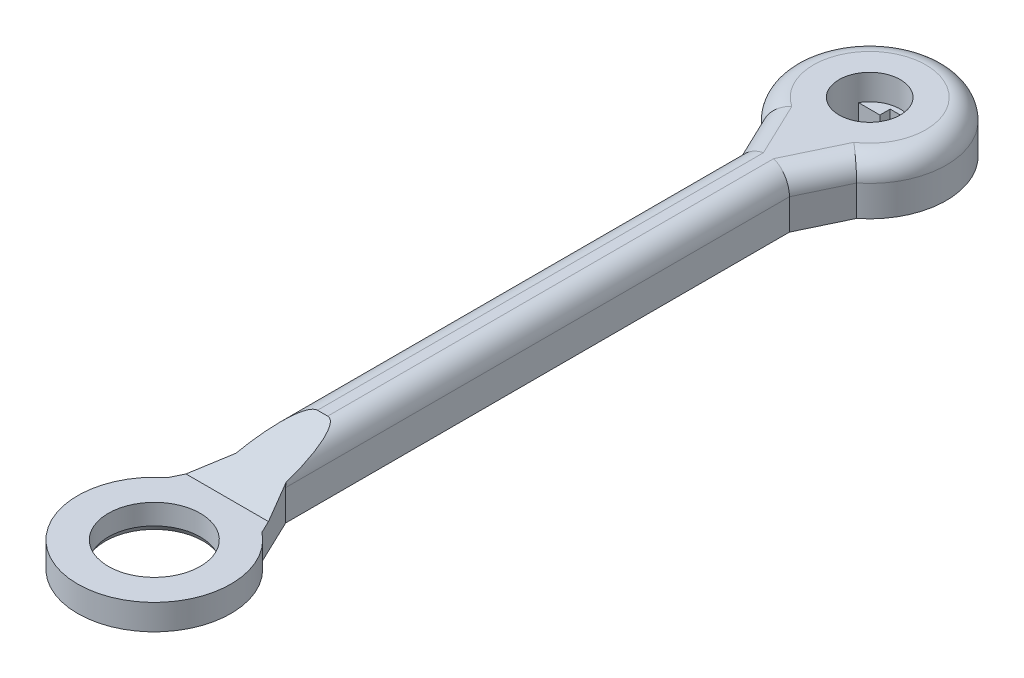
ISO-10303-21;
HEADER;
FILE_DESCRIPTION(('STEP AP214'),'2;1');
FILE_NAME('part.step','',(''),(''),'','','');
FILE_SCHEMA(('AUTOMOTIVE_DESIGN { 1 0 10303 214 1 1 1 1 }'));
ENDSEC;
DATA;
#1=APPLICATION_CONTEXT('core data for automotive mechanical design processes');
#2=APPLICATION_PROTOCOL_DEFINITION('international standard','automotive_design',2000,#1);
#3=PRODUCT_CONTEXT('',#1,'mechanical');
#4=PRODUCT('Part','Part','',(#3));
#5=PRODUCT_RELATED_PRODUCT_CATEGORY('part','',(#4));
#6=PRODUCT_DEFINITION_FORMATION('','',#4);
#7=PRODUCT_DEFINITION_CONTEXT('part definition',#1,'design');
#8=PRODUCT_DEFINITION('design','',#6,#7);
#9=PRODUCT_DEFINITION_SHAPE('','',#8);
#10=(LENGTH_UNIT() NAMED_UNIT(*) SI_UNIT(.MILLI.,.METRE.));
#11=(NAMED_UNIT(*) PLANE_ANGLE_UNIT() SI_UNIT($,.RADIAN.));
#12=(NAMED_UNIT(*) SI_UNIT($,.STERADIAN.) SOLID_ANGLE_UNIT());
#13=UNCERTAINTY_MEASURE_WITH_UNIT(LENGTH_MEASURE(1.E-05),#10,'distance_accuracy_value','');
#14=(GEOMETRIC_REPRESENTATION_CONTEXT(3) GLOBAL_UNCERTAINTY_ASSIGNED_CONTEXT((#13)) GLOBAL_UNIT_ASSIGNED_CONTEXT((#10,
#11,#12)) REPRESENTATION_CONTEXT('',''));
#15=CARTESIAN_POINT('',(0.,0.,0.));
#16=DIRECTION('',(0.,0.,1.));
#17=DIRECTION('',(1.,0.,0.));
#18=AXIS2_PLACEMENT_3D('',#15,#16,#17);
#19=CARTESIAN_POINT('',(0.,5.,-35.));
#20=DIRECTION('',(0.,-1.,0.));
#21=DIRECTION('',(0.,0.,-1.));
#22=AXIS2_PLACEMENT_3D('',#19,#20,#21);
#23=CYLINDRICAL_SURFACE('',#22,3.);
#24=CARTESIAN_POINT('',(0.,5.,-35.));
#25=DIRECTION('',(0.,1.,0.));
#26=DIRECTION('',(0.,0.,1.));
#27=AXIS2_PLACEMENT_3D('',#24,#25,#26);
#28=CIRCLE('',#27,3.);
#29=CARTESIAN_POINT('',(0.,5.,-32.));
#30=VERTEX_POINT('',#29);
#31=EDGE_CURVE('E234',#30,#30,#28,.T.);
#32=ORIENTED_EDGE('',*,*,#31,.T.);
#33=EDGE_LOOP('',(#32));
#34=FACE_BOUND('',#33,.T.);
#35=DIRECTION('',(0.,-1.,0.));
#36=VECTOR('',#35,1.);
#37=CARTESIAN_POINT('',(2.59807621135331,5.,-36.5));
#38=LINE('',#37,#36);
#39=CARTESIAN_POINT('',(2.59807621135331,2.5,-36.5));
#40=VERTEX_POINT('',#39);
#41=CARTESIAN_POINT('',(2.59807621135331,0.500000000000024,-36.5));
#42=VERTEX_POINT('',#41);
#43=EDGE_CURVE('E338',#40,#42,#38,.T.);
#44=ORIENTED_EDGE('',*,*,#43,.T.);
#45=CARTESIAN_POINT('',(0.,0.500000000000024,-35.));
#46=DIRECTION('',(0.,1.,0.));
#47=DIRECTION('',(0.,0.,1.));
#48=AXIS2_PLACEMENT_3D('',#45,#46,#47);
#49=CIRCLE('',#48,3.);
#50=CARTESIAN_POINT('',(-2.59807621135332,0.500000000000024,-36.5));
#51=VERTEX_POINT('',#50);
#52=EDGE_CURVE('E372',#42,#51,#49,.F.);
#53=ORIENTED_EDGE('',*,*,#52,.T.);
#54=DIRECTION('',(0.,-1.,0.));
#55=VECTOR('',#54,1.);
#56=CARTESIAN_POINT('',(-2.59807621135332,5.,-36.5));
#57=LINE('',#56,#55);
#58=CARTESIAN_POINT('',(-2.59807621135332,2.5,-36.5));
#59=VERTEX_POINT('',#58);
#60=EDGE_CURVE('E341',#51,#59,#57,.F.);
#61=ORIENTED_EDGE('',*,*,#60,.T.);
#62=CARTESIAN_POINT('',(0.,2.5,-35.));
#63=DIRECTION('',(0.,-1.,0.));
#64=DIRECTION('',(0.,0.,-1.));
#65=AXIS2_PLACEMENT_3D('',#62,#63,#64);
#66=CIRCLE('',#65,3.);
#67=EDGE_CURVE('E189',#59,#40,#66,.T.);
#68=ORIENTED_EDGE('',*,*,#67,.T.);
#69=EDGE_LOOP('',(#44,#53,#61,#68));
#70=FACE_BOUND('',#69,.T.);
#71=ADVANCED_FACE('F33',(#34,#70),#23,.F.);
#72=CARTESIAN_POINT('',(0.,5.,-35.));
#73=DIRECTION('',(0.,-1.,0.));
#74=DIRECTION('',(0.,0.,-1.));
#75=AXIS2_PLACEMENT_3D('',#72,#73,#74);
#76=CYLINDRICAL_SURFACE('',#75,7.5);
#77=DIRECTION('',(0.,-1.,0.));
#78=VECTOR('',#77,1.);
#79=CARTESIAN_POINT('',(-4.62423069783177,5.,-29.0952146141261));
#80=LINE('',#79,#78);
#81=CARTESIAN_POINT('',(-4.62423069783177,0.,-29.0952146141261));
#82=VERTEX_POINT('',#81);
#83=CARTESIAN_POINT('',(-4.62423069783177,3.,-29.0952146141261));
#84=VERTEX_POINT('',#83);
#85=EDGE_CURVE('E256',#82,#84,#80,.F.);
#86=ORIENTED_EDGE('',*,*,#85,.T.);
#87=CARTESIAN_POINT('',(0.,3.,-35.));
#88=DIRECTION('',(0.,1.,0.));
#89=DIRECTION('',(0.,0.,1.));
#90=AXIS2_PLACEMENT_3D('',#87,#88,#89);
#91=CIRCLE('',#90,7.5);
#92=CARTESIAN_POINT('',(4.62423069783176,3.,-29.0952146141261));
#93=VERTEX_POINT('',#92);
#94=EDGE_CURVE('E293',#84,#93,#91,.F.);
#95=ORIENTED_EDGE('',*,*,#94,.T.);
#96=DIRECTION('',(0.,-1.,0.));
#97=VECTOR('',#96,1.);
#98=CARTESIAN_POINT('',(4.62423069783176,5.,-29.0952146141261));
#99=LINE('',#98,#97);
#100=CARTESIAN_POINT('',(4.62423069783176,0.,-29.0952146141261));
#101=VERTEX_POINT('',#100);
#102=EDGE_CURVE('E254',#93,#101,#99,.T.);
#103=ORIENTED_EDGE('',*,*,#102,.T.);
#104=CARTESIAN_POINT('',(0.,0.,-35.));
#105=DIRECTION('',(0.,1.,0.));
#106=DIRECTION('',(0.,0.,1.));
#107=AXIS2_PLACEMENT_3D('',#104,#105,#106);
#108=CIRCLE('',#107,7.5);
#109=EDGE_CURVE('E240',#101,#82,#108,.T.);
#110=ORIENTED_EDGE('',*,*,#109,.T.);
#111=EDGE_LOOP('',(#86,#95,#103,#110));
#112=FACE_BOUND('',#111,.T.);
#113=ADVANCED_FACE('F419',(#112),#76,.T.);
#114=CARTESIAN_POINT('',(-2.5,5.,0.));
#115=DIRECTION('',(1.,0.,0.));
#116=DIRECTION('',(0.,0.,-1.));
#117=AXIS2_PLACEMENT_3D('',#114,#115,#116);
#118=PLANE('',#117);
#119=DIRECTION('',(0.,1.,0.));
#120=VECTOR('',#119,1.);
#121=CARTESIAN_POINT('',(-2.5,5.,24.6474232240663));
#122=LINE('',#121,#120);
#123=CARTESIAN_POINT('',(-2.5,0.,24.6474232240663));
#124=VERTEX_POINT('',#123);
#125=CARTESIAN_POINT('',(-2.5,3.,24.6474232240663));
#126=VERTEX_POINT('',#125);
#127=EDGE_CURVE('E249',#124,#126,#122,.T.);
#128=ORIENTED_EDGE('',*,*,#127,.T.);
#129=DIRECTION('',(0.,0.,1.));
#130=VECTOR('',#129,1.);
#131=CARTESIAN_POINT('',(-2.5,3.,-24.6474232240663));
#132=LINE('',#131,#130);
#133=CARTESIAN_POINT('',(-2.5,3.,-24.6474232240663));
#134=VERTEX_POINT('',#133);
#135=EDGE_CURVE('E297',#126,#134,#132,.F.);
#136=ORIENTED_EDGE('',*,*,#135,.T.);
#137=DIRECTION('',(0.,-1.,0.));
#138=VECTOR('',#137,1.);
#139=CARTESIAN_POINT('',(-2.5,0.,-24.6474232240663));
#140=LINE('',#139,#138);
#141=CARTESIAN_POINT('',(-2.5,0.,-24.6474232240663));
#142=VERTEX_POINT('',#141);
#143=EDGE_CURVE('E252',#134,#142,#140,.T.);
#144=ORIENTED_EDGE('',*,*,#143,.T.);
#145=DIRECTION('',(0.,0.,1.));
#146=VECTOR('',#145,1.);
#147=CARTESIAN_POINT('',(-2.5,0.,0.));
#148=LINE('',#147,#146);
#149=EDGE_CURVE('E243',#142,#124,#148,.T.);
#150=ORIENTED_EDGE('',*,*,#149,.T.);
#151=EDGE_LOOP('',(#128,#136,#144,#150));
#152=FACE_BOUND('',#151,.T.);
#153=ADVANCED_FACE('F425',(#152),#118,.F.);
#154=CARTESIAN_POINT('',(2.5,5.,0.));
#155=DIRECTION('',(1.,0.,0.));
#156=DIRECTION('',(0.,0.,-1.));
#157=AXIS2_PLACEMENT_3D('',#154,#155,#156);
#158=PLANE('',#157);
#159=DIRECTION('',(0.,1.,0.));
#160=VECTOR('',#159,1.);
#161=CARTESIAN_POINT('',(2.5,5.,-24.6474232240663));
#162=LINE('',#161,#160);
#163=CARTESIAN_POINT('',(2.5,0.,-24.6474232240663));
#164=VERTEX_POINT('',#163);
#165=CARTESIAN_POINT('',(2.5,3.,-24.6474232240663));
#166=VERTEX_POINT('',#165);
#167=EDGE_CURVE('E261',#164,#166,#162,.T.);
#168=ORIENTED_EDGE('',*,*,#167,.T.);
#169=DIRECTION('',(0.,0.,1.));
#170=VECTOR('',#169,1.);
#171=CARTESIAN_POINT('',(2.5,3.,0.));
#172=LINE('',#171,#170);
#173=CARTESIAN_POINT('',(2.5,3.,24.6474232240663));
#174=VERTEX_POINT('',#173);
#175=EDGE_CURVE('E299',#166,#174,#172,.T.);
#176=ORIENTED_EDGE('',*,*,#175,.T.);
#177=DIRECTION('',(0.,-1.,0.));
#178=VECTOR('',#177,1.);
#179=CARTESIAN_POINT('',(2.5,0.,24.6474232240663));
#180=LINE('',#179,#178);
#181=CARTESIAN_POINT('',(2.5,0.,24.6474232240663));
#182=VERTEX_POINT('',#181);
#183=EDGE_CURVE('E259',#174,#182,#180,.T.);
#184=ORIENTED_EDGE('',*,*,#183,.T.);
#185=DIRECTION('',(0.,0.,1.));
#186=VECTOR('',#185,1.);
#187=CARTESIAN_POINT('',(2.5,0.,0.));
#188=LINE('',#187,#186);
#189=EDGE_CURVE('E246',#164,#182,#188,.T.);
#190=ORIENTED_EDGE('',*,*,#189,.F.);
#191=EDGE_LOOP('',(#168,#176,#184,#190));
#192=FACE_BOUND('',#191,.T.);
#193=ADVANCED_FACE('F446',(#192),#158,.T.);
#194=CARTESIAN_POINT('',(0.,5.,0.));
#195=DIRECTION('',(0.,1.,0.));
#196=DIRECTION('',(0.,0.,1.));
#197=AXIS2_PLACEMENT_3D('',#194,#195,#196);
#198=PLANE('',#197);
#199=DIRECTION('',(0.,0.,1.));
#200=VECTOR('',#199,1.);
#201=CARTESIAN_POINT('',(-0.499999999999997,5.,24.6474232240663));
#202=LINE('',#201,#200);
#203=CARTESIAN_POINT('',(-0.500000000000003,5.,-25.1005050633883));
#204=VERTEX_POINT('',#203);
#205=CARTESIAN_POINT('',(-0.499999999999998,5.,18.5363087816767));
#206=VERTEX_POINT('',#205);
#207=EDGE_CURVE('E289',#204,#206,#202,.T.);
#208=ORIENTED_EDGE('',*,*,#207,.T.);
#209=DIRECTION('',(1.,0.,0.));
#210=VECTOR('',#209,1.);
#211=CARTESIAN_POINT('',(4.03737545943788,5.,18.5363087816767));
#212=LINE('',#211,#210);
#213=CARTESIAN_POINT('',(0.500000000000004,5.,18.5363087816767));
#214=VERTEX_POINT('',#213);
#215=EDGE_CURVE('E55',#206,#214,#212,.T.);
#216=ORIENTED_EDGE('',*,*,#215,.T.);
#217=DIRECTION('',(0.,0.,1.));
#218=VECTOR('',#217,1.);
#219=CARTESIAN_POINT('',(0.500000000000001,5.,0.));
#220=LINE('',#219,#218);
#221=CARTESIAN_POINT('',(0.499999999999997,5.,-25.1005050633883));
#222=VERTEX_POINT('',#221);
#223=EDGE_CURVE('E280',#214,#222,#220,.F.);
#224=ORIENTED_EDGE('',*,*,#223,.T.);
#225=DIRECTION('',(0.430964406271145,0.,-0.902368927062185));
#226=VECTOR('',#225,1.);
#227=CARTESIAN_POINT('',(2.8194928437074,5.,-29.9571434266684));
#228=LINE('',#227,#226);
#229=CARTESIAN_POINT('',(3.03836359600805,5.,-30.415422957518));
#230=VERTEX_POINT('',#229);
#231=EDGE_CURVE('E282',#222,#230,#228,.T.);
#232=ORIENTED_EDGE('',*,*,#231,.T.);
#233=CARTESIAN_POINT('',(0.,5.,-35.));
#234=DIRECTION('',(0.,1.,0.));
#235=DIRECTION('',(0.,0.,1.));
#236=AXIS2_PLACEMENT_3D('',#233,#234,#235);
#237=CIRCLE('',#236,5.5);
#238=CARTESIAN_POINT('',(-3.03836359600805,5.,-30.415422957518));
#239=VERTEX_POINT('',#238);
#240=EDGE_CURVE('E285',#230,#239,#237,.T.);
#241=ORIENTED_EDGE('',*,*,#240,.T.);
#242=DIRECTION('',(0.430964406271145,0.,0.902368927062186));
#243=VECTOR('',#242,1.);
#244=CARTESIAN_POINT('',(-0.695262145875635,5.,-25.5093520366086));
#245=LINE('',#244,#243);
#246=EDGE_CURVE('E287',#239,#204,#245,.T.);
#247=ORIENTED_EDGE('',*,*,#246,.T.);
#248=EDGE_LOOP('',(#208,#216,#224,#232,#241,#247));
#249=FACE_BOUND('',#248,.T.);
#250=ORIENTED_EDGE('',*,*,#31,.F.);
#251=EDGE_LOOP('',(#250));
#252=FACE_BOUND('',#251,.T.);
#253=ADVANCED_FACE('F443',(#249,#252),#198,.T.);
#254=CARTESIAN_POINT('',(0.,0.,0.));
#255=DIRECTION('',(0.,1.,0.));
#256=DIRECTION('',(0.,0.,1.));
#257=AXIS2_PLACEMENT_3D('',#254,#255,#256);
#258=PLANE('',#257);
#259=CARTESIAN_POINT('',(0.,0.,35.));
#260=DIRECTION('',(0.,1.,0.));
#261=DIRECTION('',(0.,0.,1.));
#262=AXIS2_PLACEMENT_3D('',#259,#260,#261);
#263=CIRCLE('',#262,4.78867513459482);
#264=CARTESIAN_POINT('',(0.,0.,30.2113248654052));
#265=VERTEX_POINT('',#264);
#266=EDGE_CURVE('E356',#265,#265,#263,.T.);
#267=ORIENTED_EDGE('',*,*,#266,.T.);
#268=EDGE_LOOP('',(#267));
#269=FACE_BOUND('',#268,.T.);
#270=DIRECTION('',(-1.,0.,0.));
#271=VECTOR('',#270,1.);
#272=CARTESIAN_POINT('',(0.,0.,-36.7886751345948));
#273=LINE('',#272,#271);
#274=CARTESIAN_POINT('',(2.7597147323201,0.,-36.7886751345948));
#275=VERTEX_POINT('',#274);
#276=CARTESIAN_POINT('',(0.788675134594824,0.,-36.7886751345948));
#277=VERTEX_POINT('',#276);
#278=EDGE_CURVE('E351',#275,#277,#273,.T.);
#279=ORIENTED_EDGE('',*,*,#278,.T.);
#280=DIRECTION('',(0.,0.,-1.));
#281=VECTOR('',#280,1.);
#282=CARTESIAN_POINT('',(0.78867513459482,0.,0.));
#283=LINE('',#282,#281);
#284=CARTESIAN_POINT('',(0.788675134594824,0.,-37.7886751345948));
#285=VERTEX_POINT('',#284);
#286=EDGE_CURVE('E353',#277,#285,#283,.T.);
#287=ORIENTED_EDGE('',*,*,#286,.T.);
#288=DIRECTION('',(-1.,0.,0.));
#289=VECTOR('',#288,1.);
#290=CARTESIAN_POINT('',(0.,0.,-37.7886751345948));
#291=LINE('',#290,#289);
#292=CARTESIAN_POINT('',(-0.788675134594824,0.,-37.7886751345948));
#293=VERTEX_POINT('',#292);
#294=EDGE_CURVE('E349',#285,#293,#291,.T.);
#295=ORIENTED_EDGE('',*,*,#294,.T.);
#296=DIRECTION('',(0.,0.,1.));
#297=VECTOR('',#296,1.);
#298=CARTESIAN_POINT('',(-0.788675134594828,0.,0.));
#299=LINE('',#298,#297);
#300=CARTESIAN_POINT('',(-0.788675134594824,0.,-36.7886751345948));
#301=VERTEX_POINT('',#300);
#302=EDGE_CURVE('E347',#293,#301,#299,.T.);
#303=ORIENTED_EDGE('',*,*,#302,.T.);
#304=DIRECTION('',(-1.,0.,0.));
#305=VECTOR('',#304,1.);
#306=CARTESIAN_POINT('',(0.,0.,-36.7886751345948));
#307=LINE('',#306,#305);
#308=CARTESIAN_POINT('',(-2.75971473232011,0.,-36.7886751345948));
#309=VERTEX_POINT('',#308);
#310=EDGE_CURVE('E345',#301,#309,#307,.T.);
#311=ORIENTED_EDGE('',*,*,#310,.T.);
#312=CARTESIAN_POINT('',(0.,0.,-35.));
#313=DIRECTION('',(0.,1.,0.));
#314=DIRECTION('',(0.,0.,1.));
#315=AXIS2_PLACEMENT_3D('',#312,#313,#314);
#316=CIRCLE('',#315,3.28867513459483);
#317=EDGE_CURVE('E343',#309,#275,#316,.T.);
#318=ORIENTED_EDGE('',*,*,#317,.T.);
#319=EDGE_LOOP('',(#279,#287,#295,#303,#311,#318));
#320=FACE_BOUND('',#319,.T.);
#321=ORIENTED_EDGE('',*,*,#109,.F.);
#322=DIRECTION('',(-0.430964406271145,0.,0.902368927062185));
#323=VECTOR('',#322,1.);
#324=CARTESIAN_POINT('',(-7.54943483026286,0.,-3.60555156736101));
#325=LINE('',#324,#323);
#326=EDGE_CURVE('E271',#101,#164,#325,.T.);
#327=ORIENTED_EDGE('',*,*,#326,.T.);
#328=ORIENTED_EDGE('',*,*,#189,.T.);
#329=DIRECTION('',(0.430964406271145,0.,0.902368927062185));
#330=VECTOR('',#329,1.);
#331=CARTESIAN_POINT('',(-7.54943483026286,0.,3.60555156736101));
#332=LINE('',#331,#330);
#333=CARTESIAN_POINT('',(4.62423069783176,0.,29.0952146141261));
#334=VERTEX_POINT('',#333);
#335=EDGE_CURVE('E275',#182,#334,#332,.T.);
#336=ORIENTED_EDGE('',*,*,#335,.T.);
#337=CARTESIAN_POINT('',(0.,0.,35.));
#338=DIRECTION('',(0.,-1.,0.));
#339=DIRECTION('',(0.,0.,-1.));
#340=AXIS2_PLACEMENT_3D('',#337,#338,#339);
#341=CIRCLE('',#340,7.5);
#342=CARTESIAN_POINT('',(-4.62423069783177,0.,29.0952146141261));
#343=VERTEX_POINT('',#342);
#344=EDGE_CURVE('E237',#334,#343,#341,.T.);
#345=ORIENTED_EDGE('',*,*,#344,.T.);
#346=DIRECTION('',(0.430964406271146,0.,-0.902368927062185));
#347=VECTOR('',#346,1.);
#348=CARTESIAN_POINT('',(7.54943483026287,0.,3.60555156736103));
#349=LINE('',#348,#347);
#350=EDGE_CURVE('E273',#343,#124,#349,.T.);
#351=ORIENTED_EDGE('',*,*,#350,.T.);
#352=ORIENTED_EDGE('',*,*,#149,.F.);
#353=DIRECTION('',(-0.430964406271145,0.,-0.902368927062186));
#354=VECTOR('',#353,1.);
#355=CARTESIAN_POINT('',(7.54943483026284,0.,-3.605551567361));
#356=LINE('',#355,#354);
#357=EDGE_CURVE('E269',#142,#82,#356,.T.);
#358=ORIENTED_EDGE('',*,*,#357,.T.);
#359=EDGE_LOOP('',(#321,#327,#328,#336,#345,#351,#352,#358));
#360=FACE_BOUND('',#359,.T.);
#361=ADVANCED_FACE('F441',(#269,#320,#360),#258,.F.);
#362=CARTESIAN_POINT('',(0.,5.,35.));
#363=DIRECTION('',(0.,-1.,0.));
#364=DIRECTION('',(0.,0.,-1.));
#365=AXIS2_PLACEMENT_3D('',#362,#363,#364);
#366=CYLINDRICAL_SURFACE('',#365,7.5);
#367=CARTESIAN_POINT('',(0.,2.5,35.));
#368=DIRECTION('',(0.,-1.,0.));
#369=DIRECTION('',(0.,0.,-1.));
#370=AXIS2_PLACEMENT_3D('',#367,#368,#369);
#371=CIRCLE('',#370,7.5);
#372=CARTESIAN_POINT('',(-4.62423069783177,2.5,29.0952146141261));
#373=VERTEX_POINT('',#372);
#374=CARTESIAN_POINT('',(4.62423069783176,2.5,29.0952146141261));
#375=VERTEX_POINT('',#374);
#376=EDGE_CURVE('E225',#373,#375,#371,.F.);
#377=ORIENTED_EDGE('',*,*,#376,.F.);
#378=DIRECTION('',(0.,-1.,0.));
#379=VECTOR('',#378,1.);
#380=CARTESIAN_POINT('',(-4.62423069783177,5.,29.0952146141261));
#381=LINE('',#380,#379);
#382=EDGE_CURVE('E267',#373,#343,#381,.T.);
#383=ORIENTED_EDGE('',*,*,#382,.T.);
#384=ORIENTED_EDGE('',*,*,#344,.F.);
#385=DIRECTION('',(0.,-1.,0.));
#386=VECTOR('',#385,1.);
#387=CARTESIAN_POINT('',(4.62423069783176,5.,29.0952146141261));
#388=LINE('',#387,#386);
#389=EDGE_CURVE('E264',#334,#375,#388,.F.);
#390=ORIENTED_EDGE('',*,*,#389,.T.);
#391=EDGE_LOOP('',(#377,#383,#384,#390));
#392=FACE_BOUND('',#391,.T.);
#393=ADVANCED_FACE('F437',(#392),#366,.T.);
#394=CARTESIAN_POINT('',(0.,5.,35.));
#395=DIRECTION('',(0.,-1.,0.));
#396=DIRECTION('',(0.,0.,-1.));
#397=AXIS2_PLACEMENT_3D('',#394,#395,#396);
#398=CYLINDRICAL_SURFACE('',#397,4.5);
#399=CARTESIAN_POINT('',(0.,0.50000000000002,35.));
#400=DIRECTION('',(0.,1.,0.));
#401=DIRECTION('',(0.,0.,1.));
#402=AXIS2_PLACEMENT_3D('',#399,#400,#401);
#403=CIRCLE('',#402,4.5);
#404=CARTESIAN_POINT('',(0.,0.500000000000019,30.5));
#405=VERTEX_POINT('',#404);
#406=EDGE_CURVE('E359',#405,#405,#403,.F.);
#407=ORIENTED_EDGE('',*,*,#406,.T.);
#408=EDGE_LOOP('',(#407));
#409=FACE_BOUND('',#408,.T.);
#410=CARTESIAN_POINT('',(0.,2.5,35.));
#411=DIRECTION('',(0.,-1.,0.));
#412=DIRECTION('',(0.,0.,-1.));
#413=AXIS2_PLACEMENT_3D('',#410,#411,#412);
#414=CIRCLE('',#413,4.5);
#415=CARTESIAN_POINT('',(0.,2.5,30.5));
#416=VERTEX_POINT('',#415);
#417=EDGE_CURVE('E231',#416,#416,#414,.T.);
#418=ORIENTED_EDGE('',*,*,#417,.F.);
#419=EDGE_LOOP('',(#418));
#420=FACE_BOUND('',#419,.T.);
#421=ADVANCED_FACE('F433',(#409,#420),#398,.F.);
#422=CARTESIAN_POINT('',(-2.5,5.,-24.6474232240663));
#423=DIRECTION('',(0.902368927062186,0.,-0.430964406271145));
#424=DIRECTION('',(0.,-1.,0.));
#425=AXIS2_PLACEMENT_3D('',#422,#423,#424);
#426=PLANE('',#425);
#427=ORIENTED_EDGE('',*,*,#143,.F.);
#428=DIRECTION('',(0.430964406271145,0.,0.902368927062186));
#429=VECTOR('',#428,1.);
#430=CARTESIAN_POINT('',(-4.62423069783177,3.,-29.0952146141261));
#431=LINE('',#430,#429);
#432=EDGE_CURVE('E295',#134,#84,#431,.F.);
#433=ORIENTED_EDGE('',*,*,#432,.T.);
#434=ORIENTED_EDGE('',*,*,#85,.F.);
#435=ORIENTED_EDGE('',*,*,#357,.F.);
#436=EDGE_LOOP('',(#427,#433,#434,#435));
#437=FACE_BOUND('',#436,.T.);
#438=ADVANCED_FACE('F436',(#437),#426,.F.);
#439=CARTESIAN_POINT('',(4.62423069783176,5.,-29.0952146141261));
#440=DIRECTION('',(-0.902368927062185,0.,-0.430964406271145));
#441=DIRECTION('',(0.,-1.,0.));
#442=AXIS2_PLACEMENT_3D('',#439,#440,#441);
#443=PLANE('',#442);
#444=ORIENTED_EDGE('',*,*,#102,.F.);
#445=DIRECTION('',(0.430964406271145,0.,-0.902368927062185));
#446=VECTOR('',#445,1.);
#447=CARTESIAN_POINT('',(2.5,3.,-24.6474232240663));
#448=LINE('',#447,#446);
#449=EDGE_CURVE('E291',#93,#166,#448,.F.);
#450=ORIENTED_EDGE('',*,*,#449,.T.);
#451=ORIENTED_EDGE('',*,*,#167,.F.);
#452=ORIENTED_EDGE('',*,*,#326,.F.);
#453=EDGE_LOOP('',(#444,#450,#451,#452));
#454=FACE_BOUND('',#453,.T.);
#455=ADVANCED_FACE('F458',(#454),#443,.F.);
#456=CARTESIAN_POINT('',(-4.62423069783177,5.,29.0952146141261));
#457=DIRECTION('',(0.902368927062185,0.,0.430964406271146));
#458=DIRECTION('',(0.,-1.,0.));
#459=AXIS2_PLACEMENT_3D('',#456,#457,#458);
#460=PLANE('',#459);
#461=DIRECTION('',(0.430964406271146,0.,-0.902368927062185));
#462=VECTOR('',#461,1.);
#463=CARTESIAN_POINT('',(-4.62423069783177,2.5,29.0952146141261));
#464=LINE('',#463,#462);
#465=CARTESIAN_POINT('',(-4.03737545943789,2.5,27.8664358005989));
#466=VERTEX_POINT('',#465);
#467=EDGE_CURVE('E228',#373,#466,#464,.T.);
#468=ORIENTED_EDGE('',*,*,#467,.T.);
#469=DIRECTION('',(0.418893654093122,0.235016829338695,-0.877094747725751));
#470=VECTOR('',#469,1.);
#471=CARTESIAN_POINT('',(-1.92515439552829,3.68504420501936,23.4437906182516));
#472=LINE('',#471,#470);
#473=CARTESIAN_POINT('',(-2.46291975996161,3.38333538312063,24.5697832706694));
#474=VERTEX_POINT('',#473);
#475=EDGE_CURVE('E374',#466,#474,#472,.T.);
#476=ORIENTED_EDGE('',*,*,#475,.T.);
#477=CARTESIAN_POINT('',(-0.499999999999998,3.,20.4597505813542));
#478=DIRECTION('',(0.902368927062185,0.,0.430964406271146));
#479=DIRECTION('',(0.430964406271146,0.,-0.902368927062185));
#480=AXIS2_PLACEMENT_3D('',#477,#478,#479);
#481=ELLIPSE('',#480,4.64075448203413,2.);
#482=EDGE_CURVE('E301',#474,#126,#481,.T.);
#483=ORIENTED_EDGE('',*,*,#482,.T.);
#484=ORIENTED_EDGE('',*,*,#127,.F.);
#485=ORIENTED_EDGE('',*,*,#350,.F.);
#486=ORIENTED_EDGE('',*,*,#382,.F.);
#487=EDGE_LOOP('',(#468,#476,#483,#484,#485,#486));
#488=FACE_BOUND('',#487,.T.);
#489=ADVANCED_FACE('F462',(#488),#460,.F.);
#490=CARTESIAN_POINT('',(2.5,5.,24.6474232240663));
#491=DIRECTION('',(-0.902368927062185,0.,0.430964406271145));
#492=DIRECTION('',(0.,-1.,0.));
#493=AXIS2_PLACEMENT_3D('',#490,#491,#492);
#494=PLANE('',#493);
#495=CARTESIAN_POINT('',(0.500000000000004,3.,20.4597505813542));
#496=DIRECTION('',(-0.902368927062185,0.,0.430964406271145));
#497=DIRECTION('',(0.430964406271145,0.,0.902368927062185));
#498=AXIS2_PLACEMENT_3D('',#495,#496,#497);
#499=ELLIPSE('',#498,4.64075448203415,2.);
#500=CARTESIAN_POINT('',(2.46291975996162,3.38333538312063,24.5697832706694));
#501=VERTEX_POINT('',#500);
#502=EDGE_CURVE('E303',#174,#501,#499,.T.);
#503=ORIENTED_EDGE('',*,*,#502,.T.);
#504=DIRECTION('',(0.418893654093121,-0.235016829338696,0.877094747725751));
#505=VECTOR('',#504,1.);
#506=CARTESIAN_POINT('',(4.73270469056009,2.1098912703783,29.3223414000232));
#507=LINE('',#506,#505);
#508=CARTESIAN_POINT('',(4.03737545943788,2.5,27.8664358005989));
#509=VERTEX_POINT('',#508);
#510=EDGE_CURVE('E11',#501,#509,#507,.T.);
#511=ORIENTED_EDGE('',*,*,#510,.T.);
#512=DIRECTION('',(0.430964406271145,0.,0.902368927062185));
#513=VECTOR('',#512,1.);
#514=CARTESIAN_POINT('',(2.5,2.5,24.6474232240663));
#515=LINE('',#514,#513);
#516=EDGE_CURVE('E277',#509,#375,#515,.T.);
#517=ORIENTED_EDGE('',*,*,#516,.T.);
#518=ORIENTED_EDGE('',*,*,#389,.F.);
#519=ORIENTED_EDGE('',*,*,#335,.F.);
#520=ORIENTED_EDGE('',*,*,#183,.F.);
#521=EDGE_LOOP('',(#503,#511,#517,#518,#519,#520));
#522=FACE_BOUND('',#521,.T.);
#523=ADVANCED_FACE('F465',(#522),#494,.F.);
#524=CARTESIAN_POINT('',(0.,2.5,0.));
#525=DIRECTION('',(0.,-1.,0.));
#526=DIRECTION('',(0.,0.,-1.));
#527=AXIS2_PLACEMENT_3D('',#524,#525,#526);
#528=PLANE('',#527);
#529=ORIENTED_EDGE('',*,*,#417,.T.);
#530=EDGE_LOOP('',(#529));
#531=FACE_BOUND('',#530,.T.);
#532=ORIENTED_EDGE('',*,*,#376,.T.);
#533=ORIENTED_EDGE('',*,*,#516,.F.);
#534=DIRECTION('',(-1.,0.,0.));
#535=VECTOR('',#534,1.);
#536=CARTESIAN_POINT('',(8.,2.5,27.8664358005989));
#537=LINE('',#536,#535);
#538=EDGE_CURVE('E222',#509,#466,#537,.T.);
#539=ORIENTED_EDGE('',*,*,#538,.T.);
#540=ORIENTED_EDGE('',*,*,#467,.F.);
#541=EDGE_LOOP('',(#532,#533,#539,#540));
#542=FACE_BOUND('',#541,.T.);
#543=ADVANCED_FACE('F431',(#531,#542),#528,.F.);
#544=CARTESIAN_POINT('',(-0.5,3.,0.));
#545=DIRECTION('',(0.,0.,-1.));
#546=DIRECTION('',(-1.,0.,0.));
#547=AXIS2_PLACEMENT_3D('',#544,#545,#546);
#548=CYLINDRICAL_SURFACE('',#547,2.);
#549=ORIENTED_EDGE('',*,*,#482,.F.);
#550=CARTESIAN_POINT('',(-0.499999999999997,3.,26.0004103968144));
#551=DIRECTION('',(0.,0.965925826289068,0.258819045102522));
#552=DIRECTION('',(0.,0.258819045102522,-0.965925826289068));
#553=AXIS2_PLACEMENT_3D('',#550,#551,#552);
#554=ELLIPSE('',#553,7.72740661031251,2.);
#555=EDGE_CURVE('E753',#474,#206,#554,.F.);
#556=ORIENTED_EDGE('',*,*,#555,.T.);
#557=ORIENTED_EDGE('',*,*,#207,.F.);
#558=CARTESIAN_POINT('',(-0.500000000000003,3.,-25.1005050633883));
#559=DIRECTION('',(-0.220942382690391,0.,-0.975286862174967));
#560=DIRECTION('',(-0.975286862174967,0.,0.220942382690391));
#561=AXIS2_PLACEMENT_3D('',#558,#559,#560);
#562=ELLIPSE('',#561,2.05067870548347,2.);
#563=EDGE_CURVE('E226',#134,#204,#562,.T.);
#564=ORIENTED_EDGE('',*,*,#563,.F.);
#565=ORIENTED_EDGE('',*,*,#135,.F.);
#566=EDGE_LOOP('',(#549,#556,#557,#564,#565));
#567=FACE_BOUND('',#566,.T.);
#568=ADVANCED_FACE('F326',(#567),#548,.T.);
#569=CARTESIAN_POINT('',(9.35417268438721,3.,-4.46748037990329));
#570=DIRECTION('',(-0.430964406271145,0.,-0.902368927062186));
#571=DIRECTION('',(-0.902368927062186,0.,0.430964406271145));
#572=AXIS2_PLACEMENT_3D('',#569,#570,#571);
#573=CYLINDRICAL_SURFACE('',#572,2.);
#574=ORIENTED_EDGE('',*,*,#563,.T.);
#575=ORIENTED_EDGE('',*,*,#246,.F.);
#576=CARTESIAN_POINT('',(-4.62423069783177,3.,-29.0952146141261));
#577=CARTESIAN_POINT('',(-4.62423118681781,3.0551448640961,-29.095214739877));
#578=CARTESIAN_POINT('',(-4.62240201588756,3.11026297044341,-29.0966812592317));
#579=CARTESIAN_POINT('',(-4.61510995320904,3.22009737733324,-29.1025309825643));
#580=CARTESIAN_POINT('',(-4.60964740443403,3.27481371530791,-29.1069139112473));
#581=CARTESIAN_POINT('',(-4.58788033838525,3.43760825475971,-29.1243872677346));
#582=CARTESIAN_POINT('',(-4.56619613756235,3.54458378460733,-29.1418024400358));
#583=CARTESIAN_POINT('',(-4.50920960973523,3.75232320813251,-29.1876693126436));
#584=CARTESIAN_POINT('',(-4.47390390812342,3.85308555536826,-29.2161237478407));
#585=CARTESIAN_POINT('',(-4.39085441005434,4.04567908334091,-29.2832603200065));
#586=CARTESIAN_POINT('',(-4.3431111112529,4.13751062121742,-29.3219420477597));
#587=CARTESIAN_POINT('',(-4.23617671767192,4.31072000930647,-29.4089164806192));
#588=CARTESIAN_POINT('',(-4.17687235326358,4.39197994553329,-29.4573044308547));
#589=CARTESIAN_POINT('',(-4.04899679625414,4.54089727425111,-29.562138872867));
#590=CARTESIAN_POINT('',(-3.98042276181022,4.60855047938126,-29.6185878362438));
#591=CARTESIAN_POINT('',(-3.83426813808129,4.73015856488953,-29.7395730141453));
#592=CARTESIAN_POINT('',(-3.75650419167032,4.78372547236635,-29.8042771226251));
#593=CARTESIAN_POINT('',(-3.59575286568493,4.8736568454774,-29.93891392786));
#594=CARTESIAN_POINT('',(-3.5127668618008,4.91002582038849,-30.0088452484713));
#595=CARTESIAN_POINT('',(-3.36583633321807,4.95776976426718,-30.1335748289806));
#596=CARTESIAN_POINT('',(-3.30251413955851,4.97317523028704,-30.1876126847249));
#597=CARTESIAN_POINT('',(-3.1753170790518,4.99401865314616,-30.2967951893425));
#598=CARTESIAN_POINT('',(-3.11144342339608,4.99947464383138,-30.3519376522193));
#599=CARTESIAN_POINT('',(-3.04464051443821,4.99998798444773,-30.4099678331815));
#600=CARTESIAN_POINT('',(-3.04150176736779,5.00000003116138,-30.4126952263422));
#601=CARTESIAN_POINT('',(-3.03836359600805,5.,-30.415422957518));
#602=B_SPLINE_CURVE_WITH_KNOTS('',3,(#576,#577,#578,#579,#580,#581,#582,#583,#584,#585,#586,
#587,#588,#589,#590,#591,#592,#593,#594,#595,#596,#597,#598,#599,#600,#601),.UNSPECIFIED.,.F.,
.F.,(4,2,2,2,2,2,2,2,2,2,2,2,4),(0.,0.165331808692461,0.330648013078509,0.660534737453257,
0.990503240909466,1.32045854362189,1.65382570787072,1.98729530670488,2.32916468698537,
2.67094437976233,2.92438488127873,3.17736555280631,3.1898400418318),.UNSPECIFIED.);
#603=EDGE_CURVE('E329',#84,#239,#602,.T.);
#604=ORIENTED_EDGE('',*,*,#603,.F.);
#605=ORIENTED_EDGE('',*,*,#432,.F.);
#606=EDGE_LOOP('',(#574,#575,#604,#605));
#607=FACE_BOUND('',#606,.T.);
#608=ADVANCED_FACE('F321',(#607),#573,.T.);
#609=CARTESIAN_POINT('',(0.500000000000001,3.,0.));
#610=DIRECTION('',(0.,0.,1.));
#611=DIRECTION('',(1.,0.,0.));
#612=AXIS2_PLACEMENT_3D('',#609,#610,#611);
#613=CYLINDRICAL_SURFACE('',#612,2.);
#614=ORIENTED_EDGE('',*,*,#223,.F.);
#615=CARTESIAN_POINT('',(0.500000000000005,3.,26.0004103968144));
#616=DIRECTION('',(0.,0.965925826289068,0.258819045102522));
#617=DIRECTION('',(0.,-0.258819045102522,0.965925826289068));
#618=AXIS2_PLACEMENT_3D('',#615,#616,#617);
#619=ELLIPSE('',#618,7.72740661031251,2.);
#620=EDGE_CURVE('E41',#214,#501,#619,.F.);
#621=ORIENTED_EDGE('',*,*,#620,.T.);
#622=ORIENTED_EDGE('',*,*,#502,.F.);
#623=ORIENTED_EDGE('',*,*,#175,.F.);
#624=CARTESIAN_POINT('',(0.499999999999998,3.,-25.1005050633883));
#625=DIRECTION('',(-0.220942382690391,0.,0.975286862174967));
#626=DIRECTION('',(-0.975286862174967,0.,-0.220942382690391));
#627=AXIS2_PLACEMENT_3D('',#624,#625,#626);
#628=ELLIPSE('',#627,2.05067870548347,2.);
#629=EDGE_CURVE('E311',#222,#166,#628,.F.);
#630=ORIENTED_EDGE('',*,*,#629,.F.);
#631=EDGE_LOOP('',(#614,#621,#622,#623,#630));
#632=FACE_BOUND('',#631,.T.);
#633=ADVANCED_FACE('F325',(#632),#613,.T.);
#634=CARTESIAN_POINT('',(0.,3.,-35.));
#635=DIRECTION('',(0.,1.,0.));
#636=DIRECTION('',(0.,0.,1.));
#637=AXIS2_PLACEMENT_3D('',#634,#635,#636);
#638=TOROIDAL_SURFACE('',#637,5.5,2.);
#639=ORIENTED_EDGE('',*,*,#603,.T.);
#640=ORIENTED_EDGE('',*,*,#240,.F.);
#641=CARTESIAN_POINT('',(4.62423069783176,3.,-29.0952146141261));
#642=CARTESIAN_POINT('',(4.62423118681781,3.0551448640961,-29.095214739877));
#643=CARTESIAN_POINT('',(4.62240201588755,3.11026297044341,-29.0966812592317));
#644=CARTESIAN_POINT('',(4.61510995320904,3.22009737733324,-29.1025309825643));
#645=CARTESIAN_POINT('',(4.60964740443402,3.27481371530791,-29.1069139112473));
#646=CARTESIAN_POINT('',(4.58788033838525,3.43760825475971,-29.1243872677346));
#647=CARTESIAN_POINT('',(4.56619613756235,3.54458378460733,-29.1418024400358));
#648=CARTESIAN_POINT('',(4.50920960973524,3.7523232081325,-29.1876693126436));
#649=CARTESIAN_POINT('',(4.47390390812342,3.85308555536826,-29.2161237478407));
#650=CARTESIAN_POINT('',(4.39085441005434,4.04567908334091,-29.2832603200066));
#651=CARTESIAN_POINT('',(4.3431111112529,4.13751062121743,-29.3219420477597));
#652=CARTESIAN_POINT('',(4.23617671767191,4.31072000930647,-29.4089164806192));
#653=CARTESIAN_POINT('',(4.17687235326358,4.39197994553329,-29.4573044308547));
#654=CARTESIAN_POINT('',(4.04899679625414,4.54089727425111,-29.562138872867));
#655=CARTESIAN_POINT('',(3.98042276181022,4.60855047938126,-29.6185878362438));
#656=CARTESIAN_POINT('',(3.83426813808128,4.73015856488953,-29.7395730141453));
#657=CARTESIAN_POINT('',(3.75650419167031,4.78372547236635,-29.8042771226251));
#658=CARTESIAN_POINT('',(3.59575286568494,4.8736568454774,-29.93891392786));
#659=CARTESIAN_POINT('',(3.51276686180085,4.9100258203885,-30.0088452484714));
#660=CARTESIAN_POINT('',(3.36583633321802,4.95776976426718,-30.1335748289805));
#661=CARTESIAN_POINT('',(3.30251413955837,4.97317523028704,-30.1876126847247));
#662=CARTESIAN_POINT('',(3.17531707905195,4.99401865314616,-30.2967951893427));
#663=CARTESIAN_POINT('',(3.11144342339659,4.99947464383138,-30.3519376522199));
#664=CARTESIAN_POINT('',(3.04464051443826,4.99998798444773,-30.4099678331815));
#665=CARTESIAN_POINT('',(3.04150176736781,5.00000003116138,-30.4126952263422));
#666=CARTESIAN_POINT('',(3.03836359600805,5.,-30.415422957518));
#667=B_SPLINE_CURVE_WITH_KNOTS('',3,(#641,#642,#643,#644,#645,#646,#647,#648,#649,#650,#651,
#652,#653,#654,#655,#656,#657,#658,#659,#660,#661,#662,#663,#664,#665,#666),.UNSPECIFIED.,.F.,
.F.,(4,2,2,2,2,2,2,2,2,2,2,2,4),(0.,0.165331808692461,0.330648013078509,0.660534737453257,
0.990503240909465,1.32045854362189,1.65382570787072,1.98729530670488,2.32916468698538,
2.67094437976233,2.92438488127872,3.17736555280631,3.1898400418318),.UNSPECIFIED.);
#668=EDGE_CURVE('E201',#93,#230,#667,.T.);
#669=ORIENTED_EDGE('',*,*,#668,.F.);
#670=ORIENTED_EDGE('',*,*,#94,.F.);
#671=EDGE_LOOP('',(#639,#640,#669,#670));
#672=FACE_BOUND('',#671,.T.);
#673=ADVANCED_FACE('F313',(#672),#638,.T.);
#674=CARTESIAN_POINT('',(-9.35417268438723,3.,-4.4674803799033));
#675=DIRECTION('',(-0.430964406271145,0.,0.902368927062185));
#676=DIRECTION('',(0.902368927062185,0.,0.430964406271145));
#677=AXIS2_PLACEMENT_3D('',#674,#675,#676);
#678=CYLINDRICAL_SURFACE('',#677,2.);
#679=ORIENTED_EDGE('',*,*,#629,.T.);
#680=ORIENTED_EDGE('',*,*,#449,.F.);
#681=ORIENTED_EDGE('',*,*,#668,.T.);
#682=ORIENTED_EDGE('',*,*,#231,.F.);
#683=EDGE_LOOP('',(#679,#680,#681,#682));
#684=FACE_BOUND('',#683,.T.);
#685=ADVANCED_FACE('F316',(#684),#678,.T.);
#686=CARTESIAN_POINT('',(0.,2.5,0.));
#687=DIRECTION('',(0.,-1.,0.));
#688=DIRECTION('',(0.,0.,-1.));
#689=AXIS2_PLACEMENT_3D('',#686,#687,#688);
#690=PLANE('',#689);
#691=DIRECTION('',(1.,0.,0.));
#692=VECTOR('',#691,1.);
#693=CARTESIAN_POINT('',(3.,2.5,-36.5));
#694=LINE('',#693,#692);
#695=CARTESIAN_POINT('',(0.5,2.5,-36.5));
#696=VERTEX_POINT('',#695);
#697=EDGE_CURVE('E213',#696,#40,#694,.T.);
#698=ORIENTED_EDGE('',*,*,#697,.T.);
#699=ORIENTED_EDGE('',*,*,#67,.F.);
#700=DIRECTION('',(1.,0.,0.));
#701=VECTOR('',#700,1.);
#702=CARTESIAN_POINT('',(-0.5,2.5,-36.5));
#703=LINE('',#702,#701);
#704=CARTESIAN_POINT('',(-0.5,2.5,-36.5));
#705=VERTEX_POINT('',#704);
#706=EDGE_CURVE('E182',#59,#705,#703,.T.);
#707=ORIENTED_EDGE('',*,*,#706,.T.);
#708=DIRECTION('',(0.,0.,-1.));
#709=VECTOR('',#708,1.);
#710=CARTESIAN_POINT('',(-0.5,2.5,-37.5));
#711=LINE('',#710,#709);
#712=CARTESIAN_POINT('',(-0.5,2.5,-37.5));
#713=VERTEX_POINT('',#712);
#714=EDGE_CURVE('E187',#705,#713,#711,.T.);
#715=ORIENTED_EDGE('',*,*,#714,.T.);
#716=DIRECTION('',(1.,0.,0.));
#717=VECTOR('',#716,1.);
#718=CARTESIAN_POINT('',(0.5,2.5,-37.5));
#719=LINE('',#718,#717);
#720=CARTESIAN_POINT('',(0.5,2.5,-37.5));
#721=VERTEX_POINT('',#720);
#722=EDGE_CURVE('E207',#713,#721,#719,.T.);
#723=ORIENTED_EDGE('',*,*,#722,.T.);
#724=DIRECTION('',(0.,0.,1.));
#725=VECTOR('',#724,1.);
#726=CARTESIAN_POINT('',(0.5,2.5,-36.5));
#727=LINE('',#726,#725);
#728=EDGE_CURVE('E209',#721,#696,#727,.T.);
#729=ORIENTED_EDGE('',*,*,#728,.T.);
#730=EDGE_LOOP('',(#698,#699,#707,#715,#723,#729));
#731=FACE_BOUND('',#730,.T.);
#732=ADVANCED_FACE('F185',(#731),#690,.F.);
#733=CARTESIAN_POINT('',(-0.5,2.5,-36.5));
#734=DIRECTION('',(0.,0.,-1.));
#735=DIRECTION('',(-1.,0.,0.));
#736=AXIS2_PLACEMENT_3D('',#733,#734,#735);
#737=PLANE('',#736);
#738=ORIENTED_EDGE('',*,*,#60,.F.);
#739=DIRECTION('',(1.,0.,0.));
#740=VECTOR('',#739,1.);
#741=CARTESIAN_POINT('',(-0.5,0.500000000000024,-36.5));
#742=LINE('',#741,#740);
#743=CARTESIAN_POINT('',(-0.5,0.500000000000024,-36.5));
#744=VERTEX_POINT('',#743);
#745=EDGE_CURVE('E198',#51,#744,#742,.T.);
#746=ORIENTED_EDGE('',*,*,#745,.T.);
#747=DIRECTION('',(0.,-1.,0.));
#748=VECTOR('',#747,1.);
#749=CARTESIAN_POINT('',(-0.5,2.5,-36.5));
#750=LINE('',#749,#748);
#751=EDGE_CURVE('E195',#705,#744,#750,.T.);
#752=ORIENTED_EDGE('',*,*,#751,.F.);
#753=ORIENTED_EDGE('',*,*,#706,.F.);
#754=EDGE_LOOP('',(#738,#746,#752,#753));
#755=FACE_BOUND('',#754,.T.);
#756=ADVANCED_FACE('F196',(#755),#737,.F.);
#757=CARTESIAN_POINT('',(-0.5,2.5,-37.5));
#758=DIRECTION('',(-1.,0.,0.));
#759=DIRECTION('',(0.,0.,1.));
#760=AXIS2_PLACEMENT_3D('',#757,#758,#759);
#761=PLANE('',#760);
#762=ORIENTED_EDGE('',*,*,#751,.T.);
#763=DIRECTION('',(0.,0.,-1.));
#764=VECTOR('',#763,1.);
#765=CARTESIAN_POINT('',(-0.5,0.500000000000024,-37.5));
#766=LINE('',#765,#764);
#767=CARTESIAN_POINT('',(-0.5,0.500000000000024,-37.5));
#768=VERTEX_POINT('',#767);
#769=EDGE_CURVE('E369',#744,#768,#766,.T.);
#770=ORIENTED_EDGE('',*,*,#769,.T.);
#771=DIRECTION('',(0.,-1.,0.));
#772=VECTOR('',#771,1.);
#773=CARTESIAN_POINT('',(-0.5,2.5,-37.5));
#774=LINE('',#773,#772);
#775=EDGE_CURVE('E202',#713,#768,#774,.T.);
#776=ORIENTED_EDGE('',*,*,#775,.F.);
#777=ORIENTED_EDGE('',*,*,#714,.F.);
#778=EDGE_LOOP('',(#762,#770,#776,#777));
#779=FACE_BOUND('',#778,.T.);
#780=ADVANCED_FACE('F204',(#779),#761,.F.);
#781=CARTESIAN_POINT('',(0.5,2.5,-37.5));
#782=DIRECTION('',(0.,0.,-1.));
#783=DIRECTION('',(-1.,0.,0.));
#784=AXIS2_PLACEMENT_3D('',#781,#782,#783);
#785=PLANE('',#784);
#786=ORIENTED_EDGE('',*,*,#775,.T.);
#787=DIRECTION('',(1.,0.,0.));
#788=VECTOR('',#787,1.);
#789=CARTESIAN_POINT('',(0.5,0.500000000000024,-37.5));
#790=LINE('',#789,#788);
#791=CARTESIAN_POINT('',(0.5,0.500000000000024,-37.5));
#792=VERTEX_POINT('',#791);
#793=EDGE_CURVE('E367',#768,#792,#790,.T.);
#794=ORIENTED_EDGE('',*,*,#793,.T.);
#795=DIRECTION('',(0.,-1.,0.));
#796=VECTOR('',#795,1.);
#797=CARTESIAN_POINT('',(0.5,2.5,-37.5));
#798=LINE('',#797,#796);
#799=EDGE_CURVE('E218',#721,#792,#798,.T.);
#800=ORIENTED_EDGE('',*,*,#799,.F.);
#801=ORIENTED_EDGE('',*,*,#722,.F.);
#802=EDGE_LOOP('',(#786,#794,#800,#801));
#803=FACE_BOUND('',#802,.T.);
#804=ADVANCED_FACE('F535',(#803),#785,.F.);
#805=CARTESIAN_POINT('',(0.5,2.5,-36.5));
#806=DIRECTION('',(1.,0.,0.));
#807=DIRECTION('',(0.,0.,-1.));
#808=AXIS2_PLACEMENT_3D('',#805,#806,#807);
#809=PLANE('',#808);
#810=ORIENTED_EDGE('',*,*,#799,.T.);
#811=DIRECTION('',(0.,0.,1.));
#812=VECTOR('',#811,1.);
#813=CARTESIAN_POINT('',(0.5,0.500000000000024,-36.5));
#814=LINE('',#813,#812);
#815=CARTESIAN_POINT('',(0.5,0.500000000000024,-36.5));
#816=VERTEX_POINT('',#815);
#817=EDGE_CURVE('E362',#792,#816,#814,.T.);
#818=ORIENTED_EDGE('',*,*,#817,.T.);
#819=DIRECTION('',(0.,-1.,0.));
#820=VECTOR('',#819,1.);
#821=CARTESIAN_POINT('',(0.5,2.5,-36.5));
#822=LINE('',#821,#820);
#823=EDGE_CURVE('E215',#696,#816,#822,.T.);
#824=ORIENTED_EDGE('',*,*,#823,.F.);
#825=ORIENTED_EDGE('',*,*,#728,.F.);
#826=EDGE_LOOP('',(#810,#818,#824,#825));
#827=FACE_BOUND('',#826,.T.);
#828=ADVANCED_FACE('F542',(#827),#809,.F.);
#829=CARTESIAN_POINT('',(3.,2.5,-36.5));
#830=DIRECTION('',(0.,0.,-1.));
#831=DIRECTION('',(-1.,0.,0.));
#832=AXIS2_PLACEMENT_3D('',#829,#830,#831);
#833=PLANE('',#832);
#834=ORIENTED_EDGE('',*,*,#823,.T.);
#835=DIRECTION('',(1.,0.,0.));
#836=VECTOR('',#835,1.);
#837=CARTESIAN_POINT('',(3.,0.500000000000024,-36.5));
#838=LINE('',#837,#836);
#839=EDGE_CURVE('E365',#816,#42,#838,.T.);
#840=ORIENTED_EDGE('',*,*,#839,.T.);
#841=ORIENTED_EDGE('',*,*,#43,.F.);
#842=ORIENTED_EDGE('',*,*,#697,.F.);
#843=EDGE_LOOP('',(#834,#840,#841,#842));
#844=FACE_BOUND('',#843,.T.);
#845=ADVANCED_FACE('F550',(#844),#833,.F.);
#846=CARTESIAN_POINT('',(0.,0.,35.));
#847=DIRECTION('',(0.,-1.,0.));
#848=DIRECTION('',(0.,0.,-1.));
#849=AXIS2_PLACEMENT_3D('',#846,#847,#848);
#850=CONICAL_SURFACE('',#849,4.78867513459482,0.523598775598295);
#851=CARTESIAN_POINT('',(0.,0.500000000000019,30.5));
#852=CARTESIAN_POINT('',(0.,0.494791666666686,30.496992967348));
#853=CARTESIAN_POINT('',(0.,0.489583333333352,30.4939859346959));
#854=CARTESIAN_POINT('',(0.,0.479166666666685,30.4879718693919));
#855=CARTESIAN_POINT('',(0.,0.473958333333352,30.4849648367399));
#856=CARTESIAN_POINT('',(0.,0.463541666666685,30.4789507714358));
#857=CARTESIAN_POINT('',(0.,0.458333333333351,30.4759437387838));
#858=CARTESIAN_POINT('',(0.,0.447916666666684,30.4699296734797));
#859=CARTESIAN_POINT('',(0.,0.442708333333351,30.4669226408277));
#860=CARTESIAN_POINT('',(0.,0.432291666666684,30.4609085755236));
#861=CARTESIAN_POINT('',(0.,0.42708333333335,30.4579015428716));
#862=CARTESIAN_POINT('',(0.,0.416666666666683,30.4518874775675));
#863=CARTESIAN_POINT('',(0.,0.411458333333349,30.4488804449155));
#864=CARTESIAN_POINT('',(0.,0.401041666666682,30.4428663796114));
#865=CARTESIAN_POINT('',(0.,0.395833333333349,30.4398593469594));
#866=CARTESIAN_POINT('',(0.,0.385416666666682,30.4338452816554));
#867=CARTESIAN_POINT('',(0.,0.380208333333348,30.4308382490033));
#868=CARTESIAN_POINT('',(0.,0.369791666666681,30.4248241836993));
#869=CARTESIAN_POINT('',(0.,0.364583333333347,30.4218171510472));
#870=CARTESIAN_POINT('',(0.,0.354166666666681,30.4158030857432));
#871=CARTESIAN_POINT('',(0.,0.348958333333347,30.4127960530912));
#872=CARTESIAN_POINT('',(0.,0.33854166666668,30.4067819877871));
#873=CARTESIAN_POINT('',(0.,0.333333333333346,30.4037749551351));
#874=CARTESIAN_POINT('',(0.,0.322916666666679,30.397760889831));
#875=CARTESIAN_POINT('',(0.,0.317708333333346,30.394753857179));
#876=CARTESIAN_POINT('',(0.,0.307291666666679,30.3887397918749));
#877=CARTESIAN_POINT('',(0.,0.302083333333345,30.3857327592229));
#878=CARTESIAN_POINT('',(0.,0.291666666666678,30.3797186939188));
#879=CARTESIAN_POINT('',(0.,0.286458333333344,30.3767116612668));
#880=CARTESIAN_POINT('',(0.,0.276041666666677,30.3706975959627));
#881=CARTESIAN_POINT('',(0.,0.270833333333344,30.3676905633107));
#882=CARTESIAN_POINT('',(0.,0.260416666666677,30.3616764980067));
#883=CARTESIAN_POINT('',(0.,0.255208333333343,30.3586694653546));
#884=CARTESIAN_POINT('',(0.,0.244791666666676,30.3526554000506));
#885=CARTESIAN_POINT('',(0.,0.239583333333342,30.3496483673985));
#886=CARTESIAN_POINT('',(0.,0.229166666666676,30.3436343020945));
#887=CARTESIAN_POINT('',(0.,0.223958333333342,30.3406272694424));
#888=CARTESIAN_POINT('',(0.,0.213541666666675,30.3346132041384));
#889=CARTESIAN_POINT('',(0.,0.208333333333341,30.3316061714864));
#890=CARTESIAN_POINT('',(0.,0.197916666666674,30.3255921061823));
#891=CARTESIAN_POINT('',(0.,0.192708333333341,30.3225850735303));
#892=CARTESIAN_POINT('',(0.,0.182291666666674,30.3165710082262));
#893=CARTESIAN_POINT('',(0.,0.17708333333334,30.3135639755742));
#894=CARTESIAN_POINT('',(0.,0.166666666666673,30.3075499102701));
#895=CARTESIAN_POINT('',(0.,0.16145833333334,30.3045428776181));
#896=CARTESIAN_POINT('',(0.,0.151041666666673,30.298528812314));
#897=CARTESIAN_POINT('',(0.,0.145833333333339,30.295521779662));
#898=CARTESIAN_POINT('',(0.,0.135416666666672,30.2895077143579));
#899=CARTESIAN_POINT('',(0.,0.130208333333338,30.2865006817059));
#900=CARTESIAN_POINT('',(0.,0.119791666666671,30.2804866164019));
#901=CARTESIAN_POINT('',(0.,0.114583333333338,30.2774795837498));
#902=CARTESIAN_POINT('',(0.,0.104166666666671,30.2714655184458));
#903=CARTESIAN_POINT('',(0.,0.0989583333333375,30.2684584857937));
#904=CARTESIAN_POINT('',(0.,0.0885416666666703,30.2624444204897));
#905=CARTESIAN_POINT('',(0.,0.0833333333333364,30.2594373878377));
#906=CARTESIAN_POINT('',(0.,0.0729166666666692,30.2534233225336));
#907=CARTESIAN_POINT('',(0.,0.0677083333333358,30.2504162898816));
#908=CARTESIAN_POINT('',(0.,0.0572916666666691,30.2444022245775));
#909=CARTESIAN_POINT('',(0.,0.0520833333333357,30.2413951919255));
#910=CARTESIAN_POINT('',(0.,0.0416666666666685,30.2353811266214));
#911=CARTESIAN_POINT('',(0.,0.0364583333333346,30.2323740939694));
#912=CARTESIAN_POINT('',(0.,0.0260416666666673,30.2263600286653));
#913=CARTESIAN_POINT('',(0.,0.020833333333334,30.2233529960133));
#914=CARTESIAN_POINT('',(0.,0.0104166666666672,30.2173389307092));
#915=CARTESIAN_POINT('',(0.,0.00520833333333388,30.2143318980572));
#916=CARTESIAN_POINT('',(0.,0.,30.2113248654052));
#917=B_SPLINE_CURVE_WITH_KNOTS('',3,(#851,#852,#853,#854,#855,#856,#857,#858,#859,#860,#861,
#862,#863,#864,#865,#866,#867,#868,#869,#870,#871,#872,#873,#874,#875,#876,#877,#878,#879,#880,
#881,#882,#883,#884,#885,#886,#887,#888,#889,#890,#891,#892,#893,#894,#895,#896,#897,#898,#899,
#900,#901,#902,#903,#904,#905,#906,#907,#908,#909,#910,#911,#912,#913,#914,#915,#916),
.UNSPECIFIED.,.F.,.F.,(4,2,2,2,2,2,2,2,2,2,2,2,2,2,2,2,2,2,2,2,2,2,2,2,2,2,2,2,2,2,2,2,4),(0.,
0.0180421959121769,0.0360843918243538,0.0541265877365307,0.0721687836487077,0.0902109795608829,
0.10825317547306,0.126295371385237,0.144337567297412,0.162379763209589,0.180421959121766,
0.198464155033941,0.216506350946118,0.234548546858295,0.252590742770472,0.270632938682649,
0.288675134594824,0.306717330507001,0.324759526419178,0.342801722331353,0.36084391824353,
0.378886114155707,0.396928310067884,0.414970505980061,0.433012701892236,0.451054897804413,
0.46909709371659,0.487139289628765,0.505181485540942,0.523223681453119,0.541265877365294,
0.559308073277471,0.577350269189648),.UNSPECIFIED.);
#918=EDGE_CURVE('BSEAM411',#405,#265,#917,.T.);
#919=ORIENTED_EDGE('',*,*,#406,.F.);
#920=ORIENTED_EDGE('',*,*,#266,.F.);
#921=ORIENTED_EDGE('',*,*,#918,.T.);
#922=ORIENTED_EDGE('',*,*,#918,.F.);
#923=EDGE_LOOP('',(#919,#921,#920,#922));
#924=FACE_BOUND('',#923,.T.);
#925=ADVANCED_FACE('F411',(#924),#850,.F.);
#926=CARTESIAN_POINT('',(-0.5,0.500000000000024,-36.5));
#927=DIRECTION('',(0.,0.499999999999996,-0.866025403784441));
#928=DIRECTION('',(1.,0.,0.));
#929=AXIS2_PLACEMENT_3D('',#926,#927,#928);
#930=PLANE('',#929);
#931=CARTESIAN_POINT('',(-2.75971473232018,0.,-36.7886751345948));
#932=CARTESIAN_POINT('',(-2.73352851853988,0.0835159716310921,-36.740457165892));
#933=CARTESIAN_POINT('',(-2.70696554465094,0.166940594843074,-36.6922919372235));
#934=CARTESIAN_POINT('',(-2.65308603872303,0.333607261767006,-36.59606689221));
#935=CARTESIAN_POINT('',(-2.62576950562306,0.416849305221708,-36.5480070760136));
#936=CARTESIAN_POINT('',(-2.59807621135344,0.500000000000052,-36.5));
#937=B_SPLINE_CURVE_WITH_KNOTS('',3,(#931,#932,#933,#934,#935,#936),.UNSPECIFIED.,.F.,.F.,(4,2,
4),(0.,0.2997771461155,0.59955471433499),.UNSPECIFIED.);
#938=EDGE_CURVE('E401',#309,#51,#937,.T.);
#939=ORIENTED_EDGE('',*,*,#938,.F.);
#940=ORIENTED_EDGE('',*,*,#310,.F.);
#941=DIRECTION('',(0.447213595499955,0.774596669241487,0.447213595499955));
#942=VECTOR('',#941,1.);
#943=CARTESIAN_POINT('',(-0.5,0.500000000000024,-36.5));
#944=LINE('',#943,#942);
#945=EDGE_CURVE('E192',#744,#301,#944,.F.);
#946=ORIENTED_EDGE('',*,*,#945,.F.);
#947=ORIENTED_EDGE('',*,*,#745,.F.);
#948=EDGE_LOOP('',(#939,#940,#946,#947));
#949=FACE_BOUND('',#948,.T.);
#950=ADVANCED_FACE('F408',(#949),#930,.F.);
#951=CARTESIAN_POINT('',(-0.5,0.500000000000024,-37.5));
#952=DIRECTION('',(-0.866025403784441,0.499999999999996,0.));
#953=DIRECTION('',(0.,0.,-1.));
#954=AXIS2_PLACEMENT_3D('',#951,#952,#953);
#955=PLANE('',#954);
#956=ORIENTED_EDGE('',*,*,#945,.T.);
#957=ORIENTED_EDGE('',*,*,#302,.F.);
#958=DIRECTION('',(0.447213595499955,0.774596669241487,0.447213595499955));
#959=VECTOR('',#958,1.);
#960=CARTESIAN_POINT('',(-0.300000000000003,0.846410161513799,-37.3));
#961=LINE('',#960,#959);
#962=EDGE_CURVE('E387',#768,#293,#961,.F.);
#963=ORIENTED_EDGE('',*,*,#962,.F.);
#964=ORIENTED_EDGE('',*,*,#769,.F.);
#965=EDGE_LOOP('',(#956,#957,#963,#964));
#966=FACE_BOUND('',#965,.T.);
#967=ADVANCED_FACE('F397',(#966),#955,.F.);
#968=CARTESIAN_POINT('',(0.,0.,-35.));
#969=DIRECTION('',(0.,-1.,0.));
#970=DIRECTION('',(0.,0.,-1.));
#971=AXIS2_PLACEMENT_3D('',#968,#969,#970);
#972=CONICAL_SURFACE('',#971,3.28867513459483,0.523598775598297);
#973=ORIENTED_EDGE('',*,*,#938,.T.);
#974=ORIENTED_EDGE('',*,*,#52,.F.);
#975=CARTESIAN_POINT('',(2.59807621135331,0.500000000000024,-36.5));
#976=CARTESIAN_POINT('',(2.62576950562297,0.416849305221691,-36.5480070760136));
#977=CARTESIAN_POINT('',(2.65308603872298,0.333607261766998,-36.59606689221));
#978=CARTESIAN_POINT('',(2.70696554465097,0.166940594843083,-36.6922919372235));
#979=CARTESIAN_POINT('',(2.73352851853994,0.0835159716311088,-36.740457165892));
#980=CARTESIAN_POINT('',(2.75971473232027,0.,-36.7886751345948));
#981=B_SPLINE_CURVE_WITH_KNOTS('',3,(#975,#976,#977,#978,#979,#980),.UNSPECIFIED.,.F.,.F.,(4,2,
4),(0.,0.299777568219491,0.599554714334992),.UNSPECIFIED.);
#982=EDGE_CURVE('E379',#275,#42,#981,.F.);
#983=ORIENTED_EDGE('',*,*,#982,.F.);
#984=ORIENTED_EDGE('',*,*,#317,.F.);
#985=EDGE_LOOP('',(#973,#974,#983,#984));
#986=FACE_BOUND('',#985,.T.);
#987=ADVANCED_FACE('F392',(#986),#972,.F.);
#988=CARTESIAN_POINT('',(0.5,0.500000000000024,-37.5));
#989=DIRECTION('',(0.,0.499999999999996,-0.866025403784441));
#990=DIRECTION('',(1.,0.,0.));
#991=AXIS2_PLACEMENT_3D('',#988,#989,#990);
#992=PLANE('',#991);
#993=ORIENTED_EDGE('',*,*,#962,.T.);
#994=ORIENTED_EDGE('',*,*,#294,.F.);
#995=DIRECTION('',(-0.447213595499955,0.774596669241487,0.447213595499955));
#996=VECTOR('',#995,1.);
#997=CARTESIAN_POINT('',(0.300000000000002,0.846410161513799,-37.3));
#998=LINE('',#997,#996);
#999=EDGE_CURVE('E377',#792,#285,#998,.F.);
#1000=ORIENTED_EDGE('',*,*,#999,.F.);
#1001=ORIENTED_EDGE('',*,*,#793,.F.);
#1002=EDGE_LOOP('',(#993,#994,#1000,#1001));
#1003=FACE_BOUND('',#1002,.T.);
#1004=ADVANCED_FACE('F396',(#1003),#992,.F.);
#1005=CARTESIAN_POINT('',(3.,0.500000000000024,-36.5));
#1006=DIRECTION('',(0.,0.499999999999996,-0.866025403784441));
#1007=DIRECTION('',(1.,0.,0.));
#1008=AXIS2_PLACEMENT_3D('',#1005,#1006,#1007);
#1009=PLANE('',#1008);
#1010=ORIENTED_EDGE('',*,*,#982,.T.);
#1011=ORIENTED_EDGE('',*,*,#839,.F.);
#1012=DIRECTION('',(0.447213595499955,-0.774596669241487,-0.447213595499955));
#1013=VECTOR('',#1012,1.);
#1014=CARTESIAN_POINT('',(0.999999999999994,-0.366025403784413,-37.));
#1015=LINE('',#1014,#1013);
#1016=EDGE_CURVE('E375',#277,#816,#1015,.F.);
#1017=ORIENTED_EDGE('',*,*,#1016,.F.);
#1018=ORIENTED_EDGE('',*,*,#278,.F.);
#1019=EDGE_LOOP('',(#1010,#1011,#1017,#1018));
#1020=FACE_BOUND('',#1019,.T.);
#1021=ADVANCED_FACE('F389',(#1020),#1009,.F.);
#1022=CARTESIAN_POINT('',(0.5,0.500000000000024,-36.5));
#1023=DIRECTION('',(0.866025403784441,0.499999999999996,0.));
#1024=DIRECTION('',(0.,0.,1.));
#1025=AXIS2_PLACEMENT_3D('',#1022,#1023,#1024);
#1026=PLANE('',#1025);
#1027=ORIENTED_EDGE('',*,*,#999,.T.);
#1028=ORIENTED_EDGE('',*,*,#286,.F.);
#1029=ORIENTED_EDGE('',*,*,#1016,.T.);
#1030=ORIENTED_EDGE('',*,*,#817,.F.);
#1031=EDGE_LOOP('',(#1027,#1028,#1029,#1030));
#1032=FACE_BOUND('',#1031,.T.);
#1033=ADVANCED_FACE('F597',(#1032),#1026,.F.);
#1034=CARTESIAN_POINT('',(8.,2.49999999999999,27.8664358005989));
#1035=DIRECTION('',(0.,0.965925826289068,0.258819045102522));
#1036=DIRECTION('',(1.,0.,0.));
#1037=AXIS2_PLACEMENT_3D('',#1034,#1035,#1036);
#1038=PLANE('',#1037);
#1039=ORIENTED_EDGE('',*,*,#620,.F.);
#1040=ORIENTED_EDGE('',*,*,#215,.F.);
#1041=ORIENTED_EDGE('',*,*,#555,.F.);
#1042=ORIENTED_EDGE('',*,*,#475,.F.);
#1043=ORIENTED_EDGE('',*,*,#538,.F.);
#1044=ORIENTED_EDGE('',*,*,#510,.F.);
#1045=EDGE_LOOP('',(#1039,#1040,#1041,#1042,#1043,#1044));
#1046=FACE_BOUND('',#1045,.T.);
#1047=ADVANCED_FACE('F35',(#1046),#1038,.T.);
#1048=CLOSED_SHELL('',(#71,#113,#153,#193,#253,#361,#393,#421,#438,#455,#489,#523,#543,#568,
#608,#633,#673,#685,#732,#756,#780,#804,#828,#845,#925,#950,#967,#987,#1004,#1021,#1033,#1047));
#1049=MANIFOLD_SOLID_BREP('B2',#1048);
#1050=ADVANCED_BREP_SHAPE_REPRESENTATION('',(#18,#1049),#14);
#1051=SHAPE_DEFINITION_REPRESENTATION(#9,#1050);
ENDSEC;
END-ISO-10303-21;
